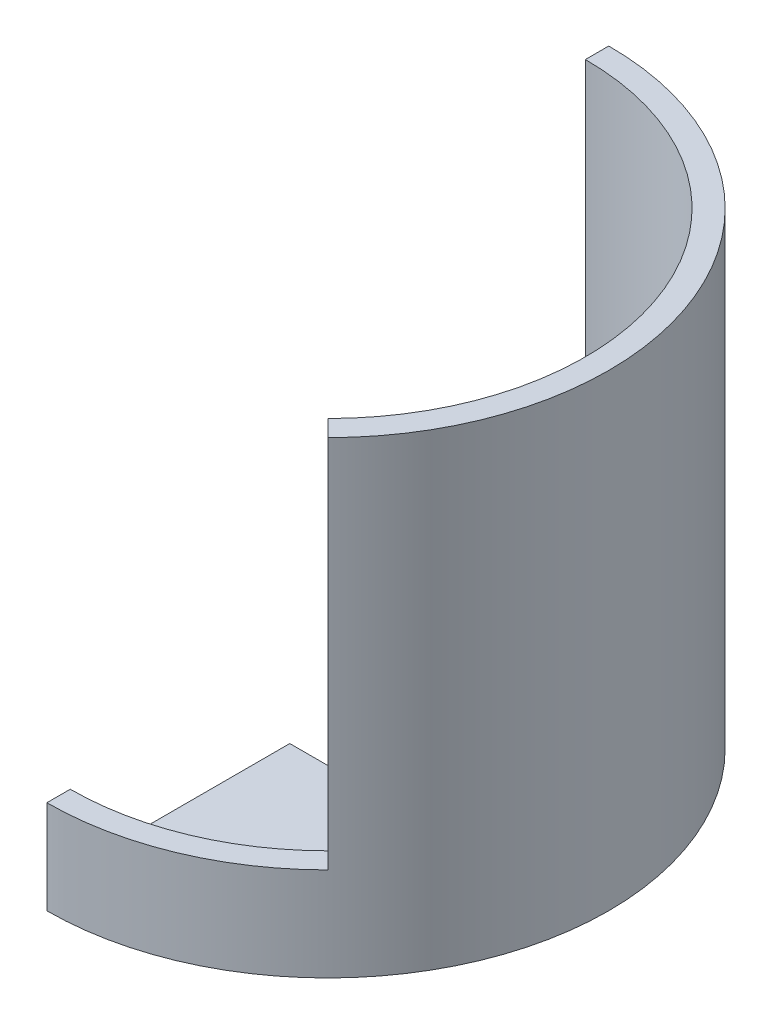
ISO-10303-21;
HEADER;
FILE_DESCRIPTION(('STEP AP214'),'2;1');
FILE_NAME('part.step','',(''),(''),'','','');
FILE_SCHEMA(('AUTOMOTIVE_DESIGN { 1 0 10303 214 1 1 1 1 }'));
ENDSEC;
DATA;
#1=APPLICATION_CONTEXT('core data for automotive mechanical design processes');
#2=APPLICATION_PROTOCOL_DEFINITION('international standard','automotive_design',2000,#1);
#3=PRODUCT_CONTEXT('',#1,'mechanical');
#4=PRODUCT('Part','Part','',(#3));
#5=PRODUCT_RELATED_PRODUCT_CATEGORY('part','',(#4));
#6=PRODUCT_DEFINITION_FORMATION('','',#4);
#7=PRODUCT_DEFINITION_CONTEXT('part definition',#1,'design');
#8=PRODUCT_DEFINITION('design','',#6,#7);
#9=PRODUCT_DEFINITION_SHAPE('','',#8);
#10=(LENGTH_UNIT() NAMED_UNIT(*) SI_UNIT(.MILLI.,.METRE.));
#11=(NAMED_UNIT(*) PLANE_ANGLE_UNIT() SI_UNIT($,.RADIAN.));
#12=(NAMED_UNIT(*) SI_UNIT($,.STERADIAN.) SOLID_ANGLE_UNIT());
#13=UNCERTAINTY_MEASURE_WITH_UNIT(LENGTH_MEASURE(1.E-05),#10,'distance_accuracy_value','');
#14=(GEOMETRIC_REPRESENTATION_CONTEXT(3) GLOBAL_UNCERTAINTY_ASSIGNED_CONTEXT((#13)) GLOBAL_UNIT_ASSIGNED_CONTEXT((#10,
#11,#12)) REPRESENTATION_CONTEXT('',''));
#15=CARTESIAN_POINT('',(0.,0.,0.));
#16=DIRECTION('',(0.,0.,1.));
#17=DIRECTION('',(1.,0.,0.));
#18=AXIS2_PLACEMENT_3D('',#15,#16,#17);
#19=CARTESIAN_POINT('',(0.,0.,0.));
#20=DIRECTION('',(1.,0.,0.));
#21=DIRECTION('',(0.,0.,-1.));
#22=AXIS2_PLACEMENT_3D('',#19,#20,#21);
#23=PLANE('',#22);
#24=DIRECTION('',(0.,0.,-1.));
#25=VECTOR('',#24,1.);
#26=CARTESIAN_POINT('',(0.,0.,0.));
#27=LINE('',#26,#25);
#28=CARTESIAN_POINT('',(0.,0.,-20.6375));
#29=VERTEX_POINT('',#28);
#30=CARTESIAN_POINT('',(0.,0.,-139.7));
#31=VERTEX_POINT('',#30);
#32=EDGE_CURVE('E144',#29,#31,#27,.T.);
#33=ORIENTED_EDGE('',*,*,#32,.F.);
#34=DIRECTION('',(0.,-1.,0.));
#35=VECTOR('',#34,1.);
#36=CARTESIAN_POINT('',(0.,12.7,-20.6375));
#37=LINE('',#36,#35);
#38=CARTESIAN_POINT('',(0.,12.7,-20.6375));
#39=VERTEX_POINT('',#38);
#40=EDGE_CURVE('E140',#39,#29,#37,.T.);
#41=ORIENTED_EDGE('',*,*,#40,.F.);
#42=DIRECTION('',(0.,0.,-1.));
#43=VECTOR('',#42,1.);
#44=CARTESIAN_POINT('',(0.,12.7,0.));
#45=LINE('',#44,#43);
#46=CARTESIAN_POINT('',(0.,12.7,-139.7));
#47=VERTEX_POINT('',#46);
#48=EDGE_CURVE('E60',#39,#47,#45,.T.);
#49=ORIENTED_EDGE('',*,*,#48,.T.);
#50=DIRECTION('',(0.,-1.,0.));
#51=VECTOR('',#50,1.);
#52=CARTESIAN_POINT('',(0.,12.7,-139.7));
#53=LINE('',#52,#51);
#54=EDGE_CURVE('E55',#31,#47,#53,.F.);
#55=ORIENTED_EDGE('',*,*,#54,.F.);
#56=EDGE_LOOP('',(#33,#41,#49,#55));
#57=FACE_BOUND('',#56,.T.);
#58=ADVANCED_FACE('F52',(#57),#23,.F.);
#59=CARTESIAN_POINT('',(0.,12.7,139.7));
#60=VERTEX_POINT('',#59);
#61=CARTESIAN_POINT('',(0.,12.7,20.6375));
#62=VERTEX_POINT('',#61);
#63=EDGE_CURVE('E146',#60,#62,#45,.T.);
#64=ORIENTED_EDGE('',*,*,#63,.T.);
#65=DIRECTION('',(0.,-1.,0.));
#66=VECTOR('',#65,1.);
#67=CARTESIAN_POINT('',(0.,12.7,20.6375));
#68=LINE('',#67,#66);
#69=CARTESIAN_POINT('',(0.,0.,20.6375));
#70=VERTEX_POINT('',#69);
#71=EDGE_CURVE('E12',#62,#70,#68,.T.);
#72=ORIENTED_EDGE('',*,*,#71,.T.);
#73=CARTESIAN_POINT('',(0.,0.,139.7));
#74=VERTEX_POINT('',#73);
#75=EDGE_CURVE('E68',#74,#70,#27,.T.);
#76=ORIENTED_EDGE('',*,*,#75,.F.);
#77=DIRECTION('',(0.,-1.,0.));
#78=VECTOR('',#77,1.);
#79=CARTESIAN_POINT('',(0.,12.7,139.7));
#80=LINE('',#79,#78);
#81=EDGE_CURVE('E147',#60,#74,#80,.T.);
#82=ORIENTED_EDGE('',*,*,#81,.F.);
#83=EDGE_LOOP('',(#64,#72,#76,#82));
#84=FACE_BOUND('',#83,.T.);
#85=ADVANCED_FACE('F156',(#84),#23,.F.);
#86=CARTESIAN_POINT('',(0.,12.7,0.));
#87=DIRECTION('',(0.,-1.,0.));
#88=DIRECTION('',(0.,0.,-1.));
#89=AXIS2_PLACEMENT_3D('',#86,#87,#88);
#90=CYLINDRICAL_SURFACE('',#89,139.7);
#91=CARTESIAN_POINT('',(0.,12.7,0.));
#92=DIRECTION('',(0.,1.,0.));
#93=DIRECTION('',(0.,0.,1.));
#94=AXIS2_PLACEMENT_3D('',#91,#92,#93);
#95=CIRCLE('',#94,139.7);
#96=EDGE_CURVE('E138',#60,#47,#95,.T.);
#97=ORIENTED_EDGE('',*,*,#96,.F.);
#98=ORIENTED_EDGE('',*,*,#81,.T.);
#99=CARTESIAN_POINT('',(0.,0.,0.));
#100=DIRECTION('',(0.,1.,0.));
#101=DIRECTION('',(0.,0.,1.));
#102=AXIS2_PLACEMENT_3D('',#99,#100,#101);
#103=CIRCLE('',#102,139.7);
#104=EDGE_CURVE('E133',#74,#31,#103,.T.);
#105=ORIENTED_EDGE('',*,*,#104,.T.);
#106=ORIENTED_EDGE('',*,*,#54,.T.);
#107=EDGE_LOOP('',(#97,#98,#105,#106));
#108=FACE_BOUND('',#107,.T.);
#109=ADVANCED_FACE('F154',(#108),#90,.T.);
#110=CARTESIAN_POINT('',(0.,12.7,0.));
#111=DIRECTION('',(0.,1.,0.));
#112=DIRECTION('',(0.,0.,1.));
#113=AXIS2_PLACEMENT_3D('',#110,#111,#112);
#114=PLANE('',#113);
#115=ORIENTED_EDGE('',*,*,#63,.F.);
#116=ORIENTED_EDGE('',*,*,#96,.T.);
#117=ORIENTED_EDGE('',*,*,#48,.F.);
#118=DIRECTION('',(1.,0.,0.));
#119=VECTOR('',#118,1.);
#120=CARTESIAN_POINT('',(-20.6375,12.7,-20.6375));
#121=LINE('',#120,#119);
#122=CARTESIAN_POINT('',(20.6375,12.7,-20.6375));
#123=VERTEX_POINT('',#122);
#124=EDGE_CURVE('E105',#39,#123,#121,.T.);
#125=ORIENTED_EDGE('',*,*,#124,.T.);
#126=DIRECTION('',(0.,0.,-1.));
#127=VECTOR('',#126,1.);
#128=CARTESIAN_POINT('',(20.6375,12.7,20.6375));
#129=LINE('',#128,#127);
#130=CARTESIAN_POINT('',(20.6375,12.7,20.6375));
#131=VERTEX_POINT('',#130);
#132=EDGE_CURVE('E110',#131,#123,#129,.T.);
#133=ORIENTED_EDGE('',*,*,#132,.F.);
#134=DIRECTION('',(1.,0.,0.));
#135=VECTOR('',#134,1.);
#136=CARTESIAN_POINT('',(-20.6375,12.7,20.6375));
#137=LINE('',#136,#135);
#138=EDGE_CURVE('E127',#62,#131,#137,.T.);
#139=ORIENTED_EDGE('',*,*,#138,.F.);
#140=EDGE_LOOP('',(#115,#116,#117,#125,#133,#139));
#141=FACE_BOUND('',#140,.T.);
#142=ADVANCED_FACE('F108',(#141),#114,.T.);
#143=CARTESIAN_POINT('',(0.,0.,0.));
#144=DIRECTION('',(0.,1.,0.));
#145=DIRECTION('',(0.,0.,1.));
#146=AXIS2_PLACEMENT_3D('',#143,#144,#145);
#147=PLANE('',#146);
#148=ORIENTED_EDGE('',*,*,#104,.F.);
#149=ORIENTED_EDGE('',*,*,#75,.T.);
#150=DIRECTION('',(1.,0.,0.));
#151=VECTOR('',#150,1.);
#152=CARTESIAN_POINT('',(-20.6375,0.,20.6375));
#153=LINE('',#152,#151);
#154=CARTESIAN_POINT('',(20.6375,0.,20.6375));
#155=VERTEX_POINT('',#154);
#156=EDGE_CURVE('E116',#70,#155,#153,.T.);
#157=ORIENTED_EDGE('',*,*,#156,.T.);
#158=DIRECTION('',(0.,0.,-1.));
#159=VECTOR('',#158,1.);
#160=CARTESIAN_POINT('',(20.6375,0.,20.6375));
#161=LINE('',#160,#159);
#162=CARTESIAN_POINT('',(20.6375,0.,-20.6375));
#163=VERTEX_POINT('',#162);
#164=EDGE_CURVE('E158',#155,#163,#161,.T.);
#165=ORIENTED_EDGE('',*,*,#164,.T.);
#166=DIRECTION('',(1.,0.,0.));
#167=VECTOR('',#166,1.);
#168=CARTESIAN_POINT('',(-20.6375,0.,-20.6375));
#169=LINE('',#168,#167);
#170=EDGE_CURVE('E131',#29,#163,#169,.T.);
#171=ORIENTED_EDGE('',*,*,#170,.F.);
#172=ORIENTED_EDGE('',*,*,#32,.T.);
#173=EDGE_LOOP('',(#148,#149,#157,#165,#171,#172));
#174=FACE_BOUND('',#173,.T.);
#175=ADVANCED_FACE('F150',(#174),#147,.F.);
#176=CARTESIAN_POINT('',(-20.6375,12.7,-20.6375));
#177=DIRECTION('',(0.,0.,-1.));
#178=DIRECTION('',(-1.,0.,0.));
#179=AXIS2_PLACEMENT_3D('',#176,#177,#178);
#180=PLANE('',#179);
#181=ORIENTED_EDGE('',*,*,#124,.F.);
#182=ORIENTED_EDGE('',*,*,#40,.T.);
#183=ORIENTED_EDGE('',*,*,#170,.T.);
#184=DIRECTION('',(0.,-1.,0.));
#185=VECTOR('',#184,1.);
#186=CARTESIAN_POINT('',(20.6375,12.7,-20.6375));
#187=LINE('',#186,#185);
#188=EDGE_CURVE('E123',#123,#163,#187,.T.);
#189=ORIENTED_EDGE('',*,*,#188,.F.);
#190=EDGE_LOOP('',(#181,#182,#183,#189));
#191=FACE_BOUND('',#190,.T.);
#192=ADVANCED_FACE('F129',(#191),#180,.F.);
#193=CARTESIAN_POINT('',(-20.6375,12.7,20.6375));
#194=DIRECTION('',(0.,0.,-1.));
#195=DIRECTION('',(-1.,0.,0.));
#196=AXIS2_PLACEMENT_3D('',#193,#194,#195);
#197=PLANE('',#196);
#198=ORIENTED_EDGE('',*,*,#71,.F.);
#199=ORIENTED_EDGE('',*,*,#138,.T.);
#200=DIRECTION('',(0.,-1.,0.));
#201=VECTOR('',#200,1.);
#202=CARTESIAN_POINT('',(20.6375,12.7,20.6375));
#203=LINE('',#202,#201);
#204=EDGE_CURVE('E126',#131,#155,#203,.T.);
#205=ORIENTED_EDGE('',*,*,#204,.T.);
#206=ORIENTED_EDGE('',*,*,#156,.F.);
#207=EDGE_LOOP('',(#198,#199,#205,#206));
#208=FACE_BOUND('',#207,.T.);
#209=ADVANCED_FACE('F157',(#208),#197,.T.);
#210=CARTESIAN_POINT('',(20.6375,12.7,20.6375));
#211=DIRECTION('',(-1.,0.,0.));
#212=DIRECTION('',(0.,0.,1.));
#213=AXIS2_PLACEMENT_3D('',#210,#211,#212);
#214=PLANE('',#213);
#215=ORIENTED_EDGE('',*,*,#164,.F.);
#216=ORIENTED_EDGE('',*,*,#204,.F.);
#217=ORIENTED_EDGE('',*,*,#132,.T.);
#218=ORIENTED_EDGE('',*,*,#188,.T.);
#219=EDGE_LOOP('',(#215,#216,#217,#218));
#220=FACE_BOUND('',#219,.T.);
#221=ADVANCED_FACE('F122',(#220),#214,.T.);
#222=CLOSED_SHELL('',(#58,#85,#109,#142,#175,#192,#209,#221));
#223=MANIFOLD_SOLID_BREP('B2',#222);
#224=CARTESIAN_POINT('',(0.,0.,0.));
#225=DIRECTION('',(1.,0.,0.));
#226=DIRECTION('',(0.,0.,-1.));
#227=AXIS2_PLACEMENT_3D('',#224,#225,#226);
#228=PLANE('',#227);
#229=DIRECTION('',(0.,0.,-1.));
#230=VECTOR('',#229,1.);
#231=CARTESIAN_POINT('',(0.,0.,107.830177644923));
#232=LINE('',#231,#230);
#233=CARTESIAN_POINT('',(0.,0.,152.494899658551));
#234=VERTEX_POINT('',#233);
#235=CARTESIAN_POINT('',(0.,0.,139.794899658551));
#236=VERTEX_POINT('',#235);
#237=EDGE_CURVE('E319',#234,#236,#232,.T.);
#238=ORIENTED_EDGE('',*,*,#237,.F.);
#239=DIRECTION('',(0.,-1.,0.));
#240=VECTOR('',#239,1.);
#241=CARTESIAN_POINT('',(0.,0.,152.494899658551));
#242=LINE('',#241,#240);
#243=CARTESIAN_POINT('',(0.,50.8,152.494899658551));
#244=VERTEX_POINT('',#243);
#245=EDGE_CURVE('E318',#234,#244,#242,.F.);
#246=ORIENTED_EDGE('',*,*,#245,.T.);
#247=DIRECTION('',(0.,0.,-1.));
#248=VECTOR('',#247,1.);
#249=CARTESIAN_POINT('',(0.,50.8,107.830177644923));
#250=LINE('',#249,#248);
#251=CARTESIAN_POINT('',(0.,50.8,139.794899658551));
#252=VERTEX_POINT('',#251);
#253=EDGE_CURVE('E232',#244,#252,#250,.T.);
#254=ORIENTED_EDGE('',*,*,#253,.T.);
#255=DIRECTION('',(0.,-1.,0.));
#256=VECTOR('',#255,1.);
#257=CARTESIAN_POINT('',(0.,0.,139.794899658551));
#258=LINE('',#257,#256);
#259=EDGE_CURVE('E227',#236,#252,#258,.F.);
#260=ORIENTED_EDGE('',*,*,#259,.F.);
#261=EDGE_LOOP('',(#238,#246,#254,#260));
#262=FACE_BOUND('',#261,.T.);
#263=ADVANCED_FACE('F224',(#262),#228,.F.);
#264=DIRECTION('',(0.,0.,-1.));
#265=VECTOR('',#264,1.);
#266=CARTESIAN_POINT('',(0.,254.,107.830177644925));
#267=LINE('',#266,#265);
#268=CARTESIAN_POINT('',(0.,254.,-139.794899658551));
#269=VERTEX_POINT('',#268);
#270=CARTESIAN_POINT('',(0.,254.,-152.494899658551));
#271=VERTEX_POINT('',#270);
#272=EDGE_CURVE('E50',#269,#271,#267,.T.);
#273=ORIENTED_EDGE('',*,*,#272,.T.);
#274=DIRECTION('',(0.,-1.,0.));
#275=VECTOR('',#274,1.);
#276=CARTESIAN_POINT('',(0.,0.,-152.494899658551));
#277=LINE('',#276,#275);
#278=CARTESIAN_POINT('',(0.,0.,-152.494899658551));
#279=VERTEX_POINT('',#278);
#280=EDGE_CURVE('E240',#271,#279,#277,.T.);
#281=ORIENTED_EDGE('',*,*,#280,.T.);
#282=CARTESIAN_POINT('',(0.,0.,-139.794899658551));
#283=VERTEX_POINT('',#282);
#284=EDGE_CURVE('E315',#283,#279,#232,.T.);
#285=ORIENTED_EDGE('',*,*,#284,.F.);
#286=DIRECTION('',(0.,-1.,0.));
#287=VECTOR('',#286,1.);
#288=CARTESIAN_POINT('',(0.,0.,-139.794899658551));
#289=LINE('',#288,#287);
#290=EDGE_CURVE('E246',#269,#283,#289,.T.);
#291=ORIENTED_EDGE('',*,*,#290,.F.);
#292=EDGE_LOOP('',(#273,#281,#285,#291));
#293=FACE_BOUND('',#292,.T.);
#294=ADVANCED_FACE('F333',(#293),#228,.F.);
#295=CARTESIAN_POINT('',(0.,0.,0.));
#296=DIRECTION('',(0.,-1.,0.));
#297=DIRECTION('',(0.,0.,-1.));
#298=AXIS2_PLACEMENT_3D('',#295,#296,#297);
#299=CYLINDRICAL_SURFACE('',#298,139.794899658551);
#300=CARTESIAN_POINT('',(0.,0.,0.));
#301=DIRECTION('',(0.,-1.,0.));
#302=DIRECTION('',(0.,0.,-1.));
#303=AXIS2_PLACEMENT_3D('',#300,#301,#302);
#304=CIRCLE('',#303,139.794899658551);
#305=EDGE_CURVE('E314',#283,#236,#304,.T.);
#306=ORIENTED_EDGE('',*,*,#305,.T.);
#307=ORIENTED_EDGE('',*,*,#259,.T.);
#308=CARTESIAN_POINT('',(0.,50.8,0.));
#309=DIRECTION('',(0.,-1.,0.));
#310=DIRECTION('',(0.,0.,-1.));
#311=AXIS2_PLACEMENT_3D('',#308,#309,#310);
#312=CIRCLE('',#311,139.794899658551);
#313=CARTESIAN_POINT('',(98.8499215238542,50.8,98.8499215238541));
#314=VERTEX_POINT('',#313);
#315=EDGE_CURVE('E293',#314,#252,#312,.T.);
#316=ORIENTED_EDGE('',*,*,#315,.F.);
#317=DIRECTION('',(0.,1.,0.));
#318=VECTOR('',#317,1.);
#319=CARTESIAN_POINT('',(98.8499215238542,0.,98.8499215238542));
#320=LINE('',#319,#318);
#321=CARTESIAN_POINT('',(98.8499215238541,254.,98.8499215238542));
#322=VERTEX_POINT('',#321);
#323=EDGE_CURVE('E289',#314,#322,#320,.T.);
#324=ORIENTED_EDGE('',*,*,#323,.T.);
#325=CARTESIAN_POINT('',(0.,254.,0.));
#326=DIRECTION('',(0.,-1.,0.));
#327=DIRECTION('',(0.,0.,-1.));
#328=AXIS2_PLACEMENT_3D('',#325,#326,#327);
#329=CIRCLE('',#328,139.794899658551);
#330=EDGE_CURVE('E278',#269,#322,#329,.T.);
#331=ORIENTED_EDGE('',*,*,#330,.F.);
#332=ORIENTED_EDGE('',*,*,#290,.T.);
#333=EDGE_LOOP('',(#306,#307,#316,#324,#331,#332));
#334=FACE_BOUND('',#333,.T.);
#335=ADVANCED_FACE('F291',(#334),#299,.F.);
#336=CARTESIAN_POINT('',(107.830177644923,0.,107.830177644923));
#337=DIRECTION('',(0.,1.,0.));
#338=DIRECTION('',(0.,0.,1.));
#339=AXIS2_PLACEMENT_3D('',#336,#337,#338);
#340=PLANE('',#339);
#341=CARTESIAN_POINT('',(0.,0.,0.));
#342=DIRECTION('',(0.,-1.,0.));
#343=DIRECTION('',(0.,0.,-1.));
#344=AXIS2_PLACEMENT_3D('',#341,#342,#343);
#345=CIRCLE('',#344,152.494899658551);
#346=EDGE_CURVE('E311',#279,#234,#345,.T.);
#347=ORIENTED_EDGE('',*,*,#346,.T.);
#348=ORIENTED_EDGE('',*,*,#237,.T.);
#349=ORIENTED_EDGE('',*,*,#305,.F.);
#350=ORIENTED_EDGE('',*,*,#284,.T.);
#351=EDGE_LOOP('',(#347,#348,#349,#350));
#352=FACE_BOUND('',#351,.T.);
#353=ADVANCED_FACE('F332',(#352),#340,.F.);
#354=CARTESIAN_POINT('',(0.,0.,0.));
#355=DIRECTION('',(0.,-1.,0.));
#356=DIRECTION('',(0.,0.,-1.));
#357=AXIS2_PLACEMENT_3D('',#354,#355,#356);
#358=CYLINDRICAL_SURFACE('',#357,152.494899658551);
#359=ORIENTED_EDGE('',*,*,#245,.F.);
#360=ORIENTED_EDGE('',*,*,#346,.F.);
#361=ORIENTED_EDGE('',*,*,#280,.F.);
#362=CARTESIAN_POINT('',(0.,254.,0.));
#363=DIRECTION('',(0.,-1.,0.));
#364=DIRECTION('',(0.,0.,-1.));
#365=AXIS2_PLACEMENT_3D('',#362,#363,#364);
#366=CIRCLE('',#365,152.494899658551);
#367=CARTESIAN_POINT('',(107.830177644923,254.,107.830177644923));
#368=VERTEX_POINT('',#367);
#369=EDGE_CURVE('E286',#271,#368,#366,.T.);
#370=ORIENTED_EDGE('',*,*,#369,.T.);
#371=DIRECTION('',(0.,1.,0.));
#372=VECTOR('',#371,1.);
#373=CARTESIAN_POINT('',(107.830177644923,0.,107.830177644923));
#374=LINE('',#373,#372);
#375=CARTESIAN_POINT('',(107.830177644923,50.8,107.830177644923));
#376=VERTEX_POINT('',#375);
#377=EDGE_CURVE('E301',#376,#368,#374,.T.);
#378=ORIENTED_EDGE('',*,*,#377,.F.);
#379=CARTESIAN_POINT('',(0.,50.8,0.));
#380=DIRECTION('',(0.,-1.,0.));
#381=DIRECTION('',(0.,0.,-1.));
#382=AXIS2_PLACEMENT_3D('',#379,#380,#381);
#383=CIRCLE('',#382,152.494899658551);
#384=EDGE_CURVE('E308',#376,#244,#383,.T.);
#385=ORIENTED_EDGE('',*,*,#384,.T.);
#386=EDGE_LOOP('',(#359,#360,#361,#370,#378,#385));
#387=FACE_BOUND('',#386,.T.);
#388=ADVANCED_FACE('F330',(#387),#358,.T.);
#389=CARTESIAN_POINT('',(107.830177644923,50.8,107.830177644923));
#390=DIRECTION('',(0.,1.,0.));
#391=DIRECTION('',(0.,0.,1.));
#392=AXIS2_PLACEMENT_3D('',#389,#390,#391);
#393=PLANE('',#392);
#394=ORIENTED_EDGE('',*,*,#253,.F.);
#395=ORIENTED_EDGE('',*,*,#384,.F.);
#396=DIRECTION('',(-0.707106781186548,0.,-0.707106781186548));
#397=VECTOR('',#396,1.);
#398=CARTESIAN_POINT('',(107.830177644923,50.8,107.830177644923));
#399=LINE('',#398,#397);
#400=EDGE_CURVE('E285',#376,#314,#399,.T.);
#401=ORIENTED_EDGE('',*,*,#400,.T.);
#402=ORIENTED_EDGE('',*,*,#315,.T.);
#403=EDGE_LOOP('',(#394,#395,#401,#402));
#404=FACE_BOUND('',#403,.T.);
#405=ADVANCED_FACE('F329',(#404),#393,.T.);
#406=CARTESIAN_POINT('',(-107.830177644922,254.,107.830177644925));
#407=DIRECTION('',(0.,1.,0.));
#408=DIRECTION('',(0.,0.,1.));
#409=AXIS2_PLACEMENT_3D('',#406,#407,#408);
#410=PLANE('',#409);
#411=ORIENTED_EDGE('',*,*,#272,.F.);
#412=ORIENTED_EDGE('',*,*,#330,.T.);
#413=DIRECTION('',(-0.707106781186548,0.,-0.707106781186548));
#414=VECTOR('',#413,1.);
#415=CARTESIAN_POINT('',(107.830177644923,254.,107.830177644923));
#416=LINE('',#415,#414);
#417=EDGE_CURVE('E283',#368,#322,#416,.T.);
#418=ORIENTED_EDGE('',*,*,#417,.F.);
#419=ORIENTED_EDGE('',*,*,#369,.F.);
#420=EDGE_LOOP('',(#411,#412,#418,#419));
#421=FACE_BOUND('',#420,.T.);
#422=ADVANCED_FACE('F280',(#421),#410,.T.);
#423=CARTESIAN_POINT('',(0.,0.,0.));
#424=DIRECTION('',(-0.707106781186548,0.,0.707106781186548));
#425=DIRECTION('',(0.707106781186548,0.,0.707106781186548));
#426=AXIS2_PLACEMENT_3D('',#423,#424,#425);
#427=PLANE('',#426);
#428=ORIENTED_EDGE('',*,*,#323,.F.);
#429=ORIENTED_EDGE('',*,*,#400,.F.);
#430=ORIENTED_EDGE('',*,*,#377,.T.);
#431=ORIENTED_EDGE('',*,*,#417,.T.);
#432=EDGE_LOOP('',(#428,#429,#430,#431));
#433=FACE_BOUND('',#432,.T.);
#434=ADVANCED_FACE('F299',(#433),#427,.T.);
#435=CLOSED_SHELL('',(#263,#294,#335,#353,#388,#405,#422,#434));
#436=MANIFOLD_SOLID_BREP('B6',#435);
#437=ADVANCED_BREP_SHAPE_REPRESENTATION('',(#18,#223,#436),#14);
#438=SHAPE_DEFINITION_REPRESENTATION(#9,#437);
ENDSEC;
END-ISO-10303-21;
